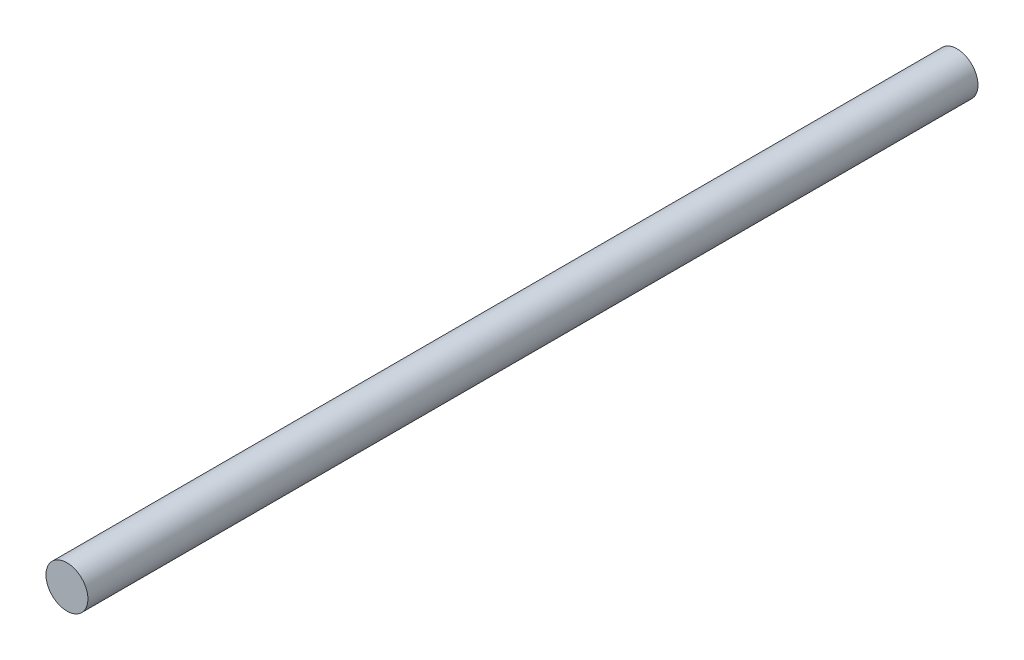
ISO-10303-21;
HEADER;
FILE_DESCRIPTION(('STEP AP214'),'2;1');
FILE_NAME('part.step','',(''),(''),'','','');
FILE_SCHEMA(('AUTOMOTIVE_DESIGN { 1 0 10303 214 1 1 1 1 }'));
ENDSEC;
DATA;
#1=APPLICATION_CONTEXT('core data for automotive mechanical design processes');
#2=APPLICATION_PROTOCOL_DEFINITION('international standard','automotive_design',2000,#1);
#3=PRODUCT_CONTEXT('',#1,'mechanical');
#4=PRODUCT('Part','Part','',(#3));
#5=PRODUCT_RELATED_PRODUCT_CATEGORY('part','',(#4));
#6=PRODUCT_DEFINITION_FORMATION('','',#4);
#7=PRODUCT_DEFINITION_CONTEXT('part definition',#1,'design');
#8=PRODUCT_DEFINITION('design','',#6,#7);
#9=PRODUCT_DEFINITION_SHAPE('','',#8);
#10=(LENGTH_UNIT() NAMED_UNIT(*) SI_UNIT(.MILLI.,.METRE.));
#11=(NAMED_UNIT(*) PLANE_ANGLE_UNIT() SI_UNIT($,.RADIAN.));
#12=(NAMED_UNIT(*) SI_UNIT($,.STERADIAN.) SOLID_ANGLE_UNIT());
#13=UNCERTAINTY_MEASURE_WITH_UNIT(LENGTH_MEASURE(1.E-05),#10,'distance_accuracy_value','');
#14=(GEOMETRIC_REPRESENTATION_CONTEXT(3) GLOBAL_UNCERTAINTY_ASSIGNED_CONTEXT((#13)) GLOBAL_UNIT_ASSIGNED_CONTEXT((#10,
#11,#12)) REPRESENTATION_CONTEXT('',''));
#15=CARTESIAN_POINT('',(0.,0.,0.));
#16=DIRECTION('',(0.,0.,1.));
#17=DIRECTION('',(1.,0.,0.));
#18=AXIS2_PLACEMENT_3D('',#15,#16,#17);
#19=CARTESIAN_POINT('',(0.,0.,305.));
#20=DIRECTION('',(0.,0.,-1.));
#21=DIRECTION('',(-1.,0.,0.));
#22=AXIS2_PLACEMENT_3D('',#19,#20,#21);
#23=CYLINDRICAL_SURFACE('',#22,7.185);
#24=CARTESIAN_POINT('',(0.,0.,305.));
#25=DIRECTION('',(0.,0.,1.));
#26=DIRECTION('',(1.,0.,0.));
#27=AXIS2_PLACEMENT_3D('',#24,#25,#26);
#28=CIRCLE('',#27,7.185);
#29=CARTESIAN_POINT('',(7.185,0.,305.));
#30=VERTEX_POINT('',#29);
#31=EDGE_CURVE('E10',#30,#30,#28,.T.);
#32=ORIENTED_EDGE('',*,*,#31,.F.);
#33=EDGE_LOOP('',(#32));
#34=FACE_BOUND('',#33,.T.);
#35=CARTESIAN_POINT('',(0.,0.,0.));
#36=DIRECTION('',(0.,0.,1.));
#37=DIRECTION('',(1.,0.,0.));
#38=AXIS2_PLACEMENT_3D('',#35,#36,#37);
#39=CIRCLE('',#38,7.185);
#40=CARTESIAN_POINT('',(7.185,0.,0.));
#41=VERTEX_POINT('',#40);
#42=EDGE_CURVE('E40',#41,#41,#39,.T.);
#43=ORIENTED_EDGE('',*,*,#42,.T.);
#44=EDGE_LOOP('',(#43));
#45=FACE_BOUND('',#44,.T.);
#46=ADVANCED_FACE('F37',(#34,#45),#23,.T.);
#47=CARTESIAN_POINT('',(0.,0.,305.));
#48=DIRECTION('',(0.,0.,1.));
#49=DIRECTION('',(1.,0.,0.));
#50=AXIS2_PLACEMENT_3D('',#47,#48,#49);
#51=PLANE('',#50);
#52=ORIENTED_EDGE('',*,*,#31,.T.);
#53=EDGE_LOOP('',(#52));
#54=FACE_BOUND('',#53,.T.);
#55=ADVANCED_FACE('F52',(#54),#51,.T.);
#56=CARTESIAN_POINT('',(0.,0.,0.));
#57=DIRECTION('',(0.,0.,1.));
#58=DIRECTION('',(1.,0.,0.));
#59=AXIS2_PLACEMENT_3D('',#56,#57,#58);
#60=PLANE('',#59);
#61=ORIENTED_EDGE('',*,*,#42,.F.);
#62=EDGE_LOOP('',(#61));
#63=FACE_BOUND('',#62,.T.);
#64=ADVANCED_FACE('F50',(#63),#60,.F.);
#65=CLOSED_SHELL('',(#46,#55,#64));
#66=MANIFOLD_SOLID_BREP('B2',#65);
#67=ADVANCED_BREP_SHAPE_REPRESENTATION('',(#18,#66),#14);
#68=SHAPE_DEFINITION_REPRESENTATION(#9,#67);
ENDSEC;
END-ISO-10303-21;
